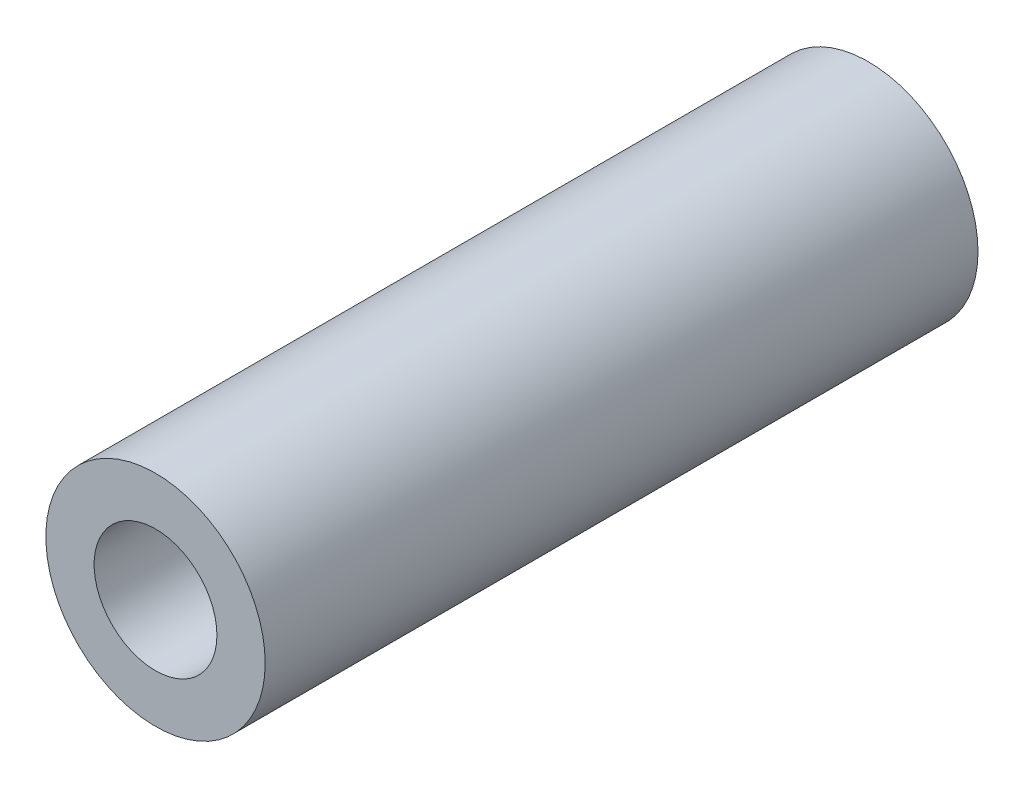
ISO-10303-21;
HEADER;
FILE_DESCRIPTION(('STEP AP214'),'2;1');
FILE_NAME('part.step','',(''),(''),'','','');
FILE_SCHEMA(('AUTOMOTIVE_DESIGN { 1 0 10303 214 1 1 1 1 }'));
ENDSEC;
DATA;
#1=APPLICATION_CONTEXT('core data for automotive mechanical design processes');
#2=APPLICATION_PROTOCOL_DEFINITION('international standard','automotive_design',2000,#1);
#3=PRODUCT_CONTEXT('',#1,'mechanical');
#4=PRODUCT('Part','Part','',(#3));
#5=PRODUCT_RELATED_PRODUCT_CATEGORY('part','',(#4));
#6=PRODUCT_DEFINITION_FORMATION('','',#4);
#7=PRODUCT_DEFINITION_CONTEXT('part definition',#1,'design');
#8=PRODUCT_DEFINITION('design','',#6,#7);
#9=PRODUCT_DEFINITION_SHAPE('','',#8);
#10=(LENGTH_UNIT() NAMED_UNIT(*) SI_UNIT(.MILLI.,.METRE.));
#11=(NAMED_UNIT(*) PLANE_ANGLE_UNIT() SI_UNIT($,.RADIAN.));
#12=(NAMED_UNIT(*) SI_UNIT($,.STERADIAN.) SOLID_ANGLE_UNIT());
#13=UNCERTAINTY_MEASURE_WITH_UNIT(LENGTH_MEASURE(1.E-05),#10,'distance_accuracy_value','');
#14=(GEOMETRIC_REPRESENTATION_CONTEXT(3) GLOBAL_UNCERTAINTY_ASSIGNED_CONTEXT((#13)) GLOBAL_UNIT_ASSIGNED_CONTEXT((#10,
#11,#12)) REPRESENTATION_CONTEXT('',''));
#15=CARTESIAN_POINT('',(0.,0.,0.));
#16=DIRECTION('',(0.,0.,1.));
#17=DIRECTION('',(1.,0.,0.));
#18=AXIS2_PLACEMENT_3D('',#15,#16,#17);
#19=CARTESIAN_POINT('',(0.,0.,10.31875));
#20=DIRECTION('',(0.,0.,1.));
#21=DIRECTION('',(1.,0.,0.));
#22=AXIS2_PLACEMENT_3D('',#19,#20,#21);
#23=PLANE('',#22);
#24=CARTESIAN_POINT('',(0.,0.,10.31875));
#25=DIRECTION('',(0.,0.,1.));
#26=DIRECTION('',(1.,0.,0.));
#27=AXIS2_PLACEMENT_3D('',#24,#25,#26);
#28=CIRCLE('',#27,3.175);
#29=CARTESIAN_POINT('',(3.175,0.,10.31875));
#30=VERTEX_POINT('',#29);
#31=EDGE_CURVE('E10',#30,#30,#28,.T.);
#32=ORIENTED_EDGE('',*,*,#31,.T.);
#33=EDGE_LOOP('',(#32));
#34=FACE_BOUND('',#33,.T.);
#35=CARTESIAN_POINT('',(0.,0.,10.31875));
#36=DIRECTION('',(0.,0.,1.));
#37=DIRECTION('',(1.,0.,0.));
#38=AXIS2_PLACEMENT_3D('',#35,#36,#37);
#39=CIRCLE('',#38,1.778);
#40=CARTESIAN_POINT('',(1.778,0.,10.31875));
#41=VERTEX_POINT('',#40);
#42=EDGE_CURVE('E43',#41,#41,#39,.T.);
#43=ORIENTED_EDGE('',*,*,#42,.F.);
#44=EDGE_LOOP('',(#43));
#45=FACE_BOUND('',#44,.T.);
#46=ADVANCED_FACE('F32',(#34,#45),#23,.T.);
#47=CARTESIAN_POINT('',(0.,0.,-10.31875));
#48=DIRECTION('',(0.,0.,1.));
#49=DIRECTION('',(1.,0.,0.));
#50=AXIS2_PLACEMENT_3D('',#47,#48,#49);
#51=PLANE('',#50);
#52=CARTESIAN_POINT('',(0.,0.,-10.31875));
#53=DIRECTION('',(0.,0.,1.));
#54=DIRECTION('',(1.,0.,0.));
#55=AXIS2_PLACEMENT_3D('',#52,#53,#54);
#56=CIRCLE('',#55,3.175);
#57=CARTESIAN_POINT('',(3.175,0.,-10.31875));
#58=VERTEX_POINT('',#57);
#59=EDGE_CURVE('E36',#58,#58,#56,.T.);
#60=ORIENTED_EDGE('',*,*,#59,.F.);
#61=EDGE_LOOP('',(#60));
#62=FACE_BOUND('',#61,.T.);
#63=CARTESIAN_POINT('',(0.,0.,-10.31875));
#64=DIRECTION('',(0.,0.,1.));
#65=DIRECTION('',(1.,0.,0.));
#66=AXIS2_PLACEMENT_3D('',#63,#64,#65);
#67=CIRCLE('',#66,1.778);
#68=CARTESIAN_POINT('',(1.778,0.,-10.31875));
#69=VERTEX_POINT('',#68);
#70=EDGE_CURVE('E45',#69,#69,#67,.T.);
#71=ORIENTED_EDGE('',*,*,#70,.T.);
#72=EDGE_LOOP('',(#71));
#73=FACE_BOUND('',#72,.T.);
#74=ADVANCED_FACE('F55',(#62,#73),#51,.F.);
#75=CARTESIAN_POINT('',(0.,0.,10.31875));
#76=DIRECTION('',(0.,0.,-1.));
#77=DIRECTION('',(-1.,0.,0.));
#78=AXIS2_PLACEMENT_3D('',#75,#76,#77);
#79=CYLINDRICAL_SURFACE('',#78,3.175);
#80=ORIENTED_EDGE('',*,*,#31,.F.);
#81=EDGE_LOOP('',(#80));
#82=FACE_BOUND('',#81,.T.);
#83=ORIENTED_EDGE('',*,*,#59,.T.);
#84=EDGE_LOOP('',(#83));
#85=FACE_BOUND('',#84,.T.);
#86=ADVANCED_FACE('F34',(#82,#85),#79,.T.);
#87=CARTESIAN_POINT('',(0.,0.,10.31875));
#88=DIRECTION('',(0.,0.,-1.));
#89=DIRECTION('',(-1.,0.,0.));
#90=AXIS2_PLACEMENT_3D('',#87,#88,#89);
#91=CYLINDRICAL_SURFACE('',#90,1.778);
#92=ORIENTED_EDGE('',*,*,#42,.T.);
#93=EDGE_LOOP('',(#92));
#94=FACE_BOUND('',#93,.T.);
#95=ORIENTED_EDGE('',*,*,#70,.F.);
#96=EDGE_LOOP('',(#95));
#97=FACE_BOUND('',#96,.T.);
#98=ADVANCED_FACE('F51',(#94,#97),#91,.F.);
#99=CLOSED_SHELL('',(#46,#74,#86,#98));
#100=MANIFOLD_SOLID_BREP('B2',#99);
#101=ADVANCED_BREP_SHAPE_REPRESENTATION('',(#18,#100),#14);
#102=SHAPE_DEFINITION_REPRESENTATION(#9,#101);
ENDSEC;
END-ISO-10303-21;
